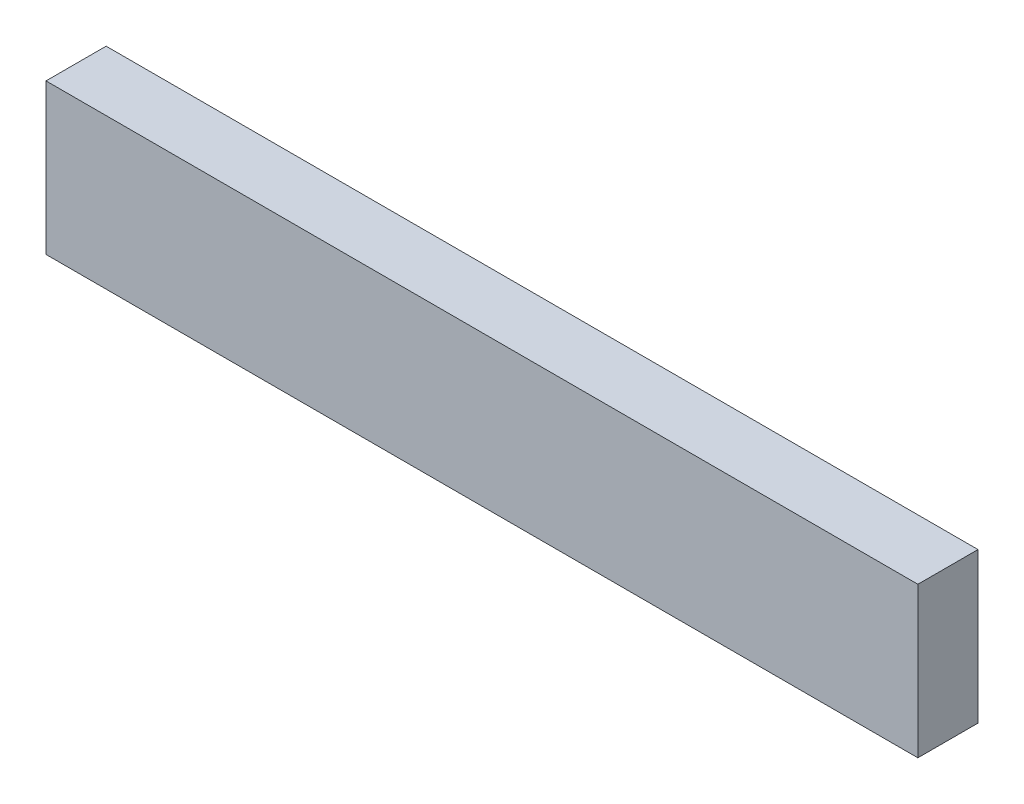
ISO-10303-21;
HEADER;
FILE_DESCRIPTION(('STEP AP214'),'2;1');
FILE_NAME('part.step','',(''),(''),'','','');
FILE_SCHEMA(('AUTOMOTIVE_DESIGN { 1 0 10303 214 1 1 1 1 }'));
ENDSEC;
DATA;
#1=APPLICATION_CONTEXT('core data for automotive mechanical design processes');
#2=APPLICATION_PROTOCOL_DEFINITION('international standard','automotive_design',2000,#1);
#3=PRODUCT_CONTEXT('',#1,'mechanical');
#4=PRODUCT('Part','Part','',(#3));
#5=PRODUCT_RELATED_PRODUCT_CATEGORY('part','',(#4));
#6=PRODUCT_DEFINITION_FORMATION('','',#4);
#7=PRODUCT_DEFINITION_CONTEXT('part definition',#1,'design');
#8=PRODUCT_DEFINITION('design','',#6,#7);
#9=PRODUCT_DEFINITION_SHAPE('','',#8);
#10=(LENGTH_UNIT() NAMED_UNIT(*) SI_UNIT(.MILLI.,.METRE.));
#11=(NAMED_UNIT(*) PLANE_ANGLE_UNIT() SI_UNIT($,.RADIAN.));
#12=(NAMED_UNIT(*) SI_UNIT($,.STERADIAN.) SOLID_ANGLE_UNIT());
#13=UNCERTAINTY_MEASURE_WITH_UNIT(LENGTH_MEASURE(1.E-05),#10,'distance_accuracy_value','');
#14=(GEOMETRIC_REPRESENTATION_CONTEXT(3) GLOBAL_UNCERTAINTY_ASSIGNED_CONTEXT((#13)) GLOBAL_UNIT_ASSIGNED_CONTEXT((#10,
#11,#12)) REPRESENTATION_CONTEXT('',''));
#15=CARTESIAN_POINT('',(0.,0.,0.));
#16=DIRECTION('',(0.,0.,1.));
#17=DIRECTION('',(1.,0.,0.));
#18=AXIS2_PLACEMENT_3D('',#15,#16,#17);
#19=CARTESIAN_POINT('',(-19.5,2.,-77.5));
#20=DIRECTION('',(0.,0.,1.));
#21=DIRECTION('',(1.,0.,0.));
#22=AXIS2_PLACEMENT_3D('',#19,#20,#21);
#23=PLANE('',#22);
#24=DIRECTION('',(0.,1.,0.));
#25=VECTOR('',#24,1.);
#26=CARTESIAN_POINT('',(14.5,0.,-77.5));
#27=LINE('',#26,#25);
#28=CARTESIAN_POINT('',(14.5,26.8,-77.5));
#29=VERTEX_POINT('',#28);
#30=CARTESIAN_POINT('',(14.5,31.8,-77.5));
#31=VERTEX_POINT('',#30);
#32=EDGE_CURVE('E86',#29,#31,#27,.T.);
#33=ORIENTED_EDGE('',*,*,#32,.F.);
#34=DIRECTION('',(-1.,0.,0.));
#35=VECTOR('',#34,1.);
#36=CARTESIAN_POINT('',(-14.5,26.8,-77.5));
#37=LINE('',#36,#35);
#38=CARTESIAN_POINT('',(-14.5,26.8,-77.5));
#39=VERTEX_POINT('',#38);
#40=EDGE_CURVE('E73',#29,#39,#37,.T.);
#41=ORIENTED_EDGE('',*,*,#40,.T.);
#42=DIRECTION('',(0.,-1.,0.));
#43=VECTOR('',#42,1.);
#44=CARTESIAN_POINT('',(-14.5,40.,-77.5));
#45=LINE('',#44,#43);
#46=CARTESIAN_POINT('',(-14.5,31.8,-77.5));
#47=VERTEX_POINT('',#46);
#48=EDGE_CURVE('E92',#47,#39,#45,.T.);
#49=ORIENTED_EDGE('',*,*,#48,.F.);
#50=DIRECTION('',(-1.,0.,0.));
#51=VECTOR('',#50,1.);
#52=CARTESIAN_POINT('',(0.,31.8,-77.5));
#53=LINE('',#52,#51);
#54=EDGE_CURVE('E90',#31,#47,#53,.T.);
#55=ORIENTED_EDGE('',*,*,#54,.F.);
#56=EDGE_LOOP('',(#33,#41,#49,#55));
#57=FACE_BOUND('',#56,.T.);
#58=ADVANCED_FACE('F35',(#57),#23,.F.);
#59=CARTESIAN_POINT('',(-14.5,40.,-77.5));
#60=DIRECTION('',(-1.,0.,0.));
#61=DIRECTION('',(0.,-1.,0.));
#62=AXIS2_PLACEMENT_3D('',#59,#60,#61);
#63=PLANE('',#62);
#64=DIRECTION('',(0.,0.,1.));
#65=VECTOR('',#64,1.);
#66=CARTESIAN_POINT('',(-14.5,26.8,-77.5));
#67=LINE('',#66,#65);
#68=CARTESIAN_POINT('',(-14.5,26.8,-75.5));
#69=VERTEX_POINT('',#68);
#70=EDGE_CURVE('E76',#39,#69,#67,.T.);
#71=ORIENTED_EDGE('',*,*,#70,.T.);
#72=DIRECTION('',(0.,1.,0.));
#73=VECTOR('',#72,1.);
#74=CARTESIAN_POINT('',(-14.5,40.,-75.5));
#75=LINE('',#74,#73);
#76=CARTESIAN_POINT('',(-14.5,31.8,-75.5));
#77=VERTEX_POINT('',#76);
#78=EDGE_CURVE('E91',#69,#77,#75,.T.);
#79=ORIENTED_EDGE('',*,*,#78,.T.);
#80=DIRECTION('',(0.,0.,1.));
#81=VECTOR('',#80,1.);
#82=CARTESIAN_POINT('',(-14.5,31.8,-77.5));
#83=LINE('',#82,#81);
#84=EDGE_CURVE('E95',#47,#77,#83,.T.);
#85=ORIENTED_EDGE('',*,*,#84,.F.);
#86=ORIENTED_EDGE('',*,*,#48,.T.);
#87=EDGE_LOOP('',(#71,#79,#85,#86));
#88=FACE_BOUND('',#87,.T.);
#89=ADVANCED_FACE('F106',(#88),#63,.T.);
#90=CARTESIAN_POINT('',(14.5,0.,-77.5));
#91=DIRECTION('',(1.,0.,0.));
#92=DIRECTION('',(0.,0.,-1.));
#93=AXIS2_PLACEMENT_3D('',#90,#91,#92);
#94=PLANE('',#93);
#95=DIRECTION('',(0.,0.,1.));
#96=VECTOR('',#95,1.);
#97=CARTESIAN_POINT('',(14.5,26.8,-77.5));
#98=LINE('',#97,#96);
#99=CARTESIAN_POINT('',(14.5,26.8,-75.5));
#100=VERTEX_POINT('',#99);
#101=EDGE_CURVE('E49',#29,#100,#98,.T.);
#102=ORIENTED_EDGE('',*,*,#101,.F.);
#103=ORIENTED_EDGE('',*,*,#32,.T.);
#104=DIRECTION('',(0.,0.,1.));
#105=VECTOR('',#104,1.);
#106=CARTESIAN_POINT('',(14.5,31.8,-77.5));
#107=LINE('',#106,#105);
#108=CARTESIAN_POINT('',(14.5,31.8,-75.5));
#109=VERTEX_POINT('',#108);
#110=EDGE_CURVE('E98',#31,#109,#107,.T.);
#111=ORIENTED_EDGE('',*,*,#110,.T.);
#112=DIRECTION('',(0.,-1.,0.));
#113=VECTOR('',#112,1.);
#114=CARTESIAN_POINT('',(14.5,40.,-75.5));
#115=LINE('',#114,#113);
#116=EDGE_CURVE('E42',#109,#100,#115,.T.);
#117=ORIENTED_EDGE('',*,*,#116,.T.);
#118=EDGE_LOOP('',(#102,#103,#111,#117));
#119=FACE_BOUND('',#118,.T.);
#120=ADVANCED_FACE('F85',(#119),#94,.T.);
#121=CARTESIAN_POINT('',(0.,40.,-75.5));
#122=DIRECTION('',(0.,0.,-1.));
#123=DIRECTION('',(-1.,0.,0.));
#124=AXIS2_PLACEMENT_3D('',#121,#122,#123);
#125=PLANE('',#124);
#126=ORIENTED_EDGE('',*,*,#78,.F.);
#127=DIRECTION('',(-1.,0.,0.));
#128=VECTOR('',#127,1.);
#129=CARTESIAN_POINT('',(-14.5,26.8,-75.5));
#130=LINE('',#129,#128);
#131=EDGE_CURVE('E81',#100,#69,#130,.T.);
#132=ORIENTED_EDGE('',*,*,#131,.F.);
#133=ORIENTED_EDGE('',*,*,#116,.F.);
#134=DIRECTION('',(-1.,0.,0.));
#135=VECTOR('',#134,1.);
#136=CARTESIAN_POINT('',(21.9721359549996,31.8,-75.5));
#137=LINE('',#136,#135);
#138=EDGE_CURVE('E11',#109,#77,#137,.T.);
#139=ORIENTED_EDGE('',*,*,#138,.T.);
#140=EDGE_LOOP('',(#126,#132,#133,#139));
#141=FACE_BOUND('',#140,.T.);
#142=ADVANCED_FACE('F108',(#141),#125,.F.);
#143=CARTESIAN_POINT('',(0.,31.8,-77.5));
#144=DIRECTION('',(0.,1.,0.));
#145=DIRECTION('',(0.,0.,1.));
#146=AXIS2_PLACEMENT_3D('',#143,#144,#145);
#147=PLANE('',#146);
#148=ORIENTED_EDGE('',*,*,#138,.F.);
#149=ORIENTED_EDGE('',*,*,#110,.F.);
#150=ORIENTED_EDGE('',*,*,#54,.T.);
#151=ORIENTED_EDGE('',*,*,#84,.T.);
#152=EDGE_LOOP('',(#148,#149,#150,#151));
#153=FACE_BOUND('',#152,.T.);
#154=ADVANCED_FACE('F110',(#153),#147,.T.);
#155=CARTESIAN_POINT('',(-14.5,26.8,-77.5));
#156=DIRECTION('',(0.,1.,0.));
#157=DIRECTION('',(0.,0.,1.));
#158=AXIS2_PLACEMENT_3D('',#155,#156,#157);
#159=PLANE('',#158);
#160=ORIENTED_EDGE('',*,*,#131,.T.);
#161=ORIENTED_EDGE('',*,*,#70,.F.);
#162=ORIENTED_EDGE('',*,*,#40,.F.);
#163=ORIENTED_EDGE('',*,*,#101,.T.);
#164=EDGE_LOOP('',(#160,#161,#162,#163));
#165=FACE_BOUND('',#164,.T.);
#166=ADVANCED_FACE('F74',(#165),#159,.F.);
#167=CLOSED_SHELL('',(#58,#89,#120,#142,#154,#166));
#168=MANIFOLD_SOLID_BREP('B2',#167);
#169=ADVANCED_BREP_SHAPE_REPRESENTATION('',(#18,#168),#14);
#170=SHAPE_DEFINITION_REPRESENTATION(#9,#169);
ENDSEC;
END-ISO-10303-21;
